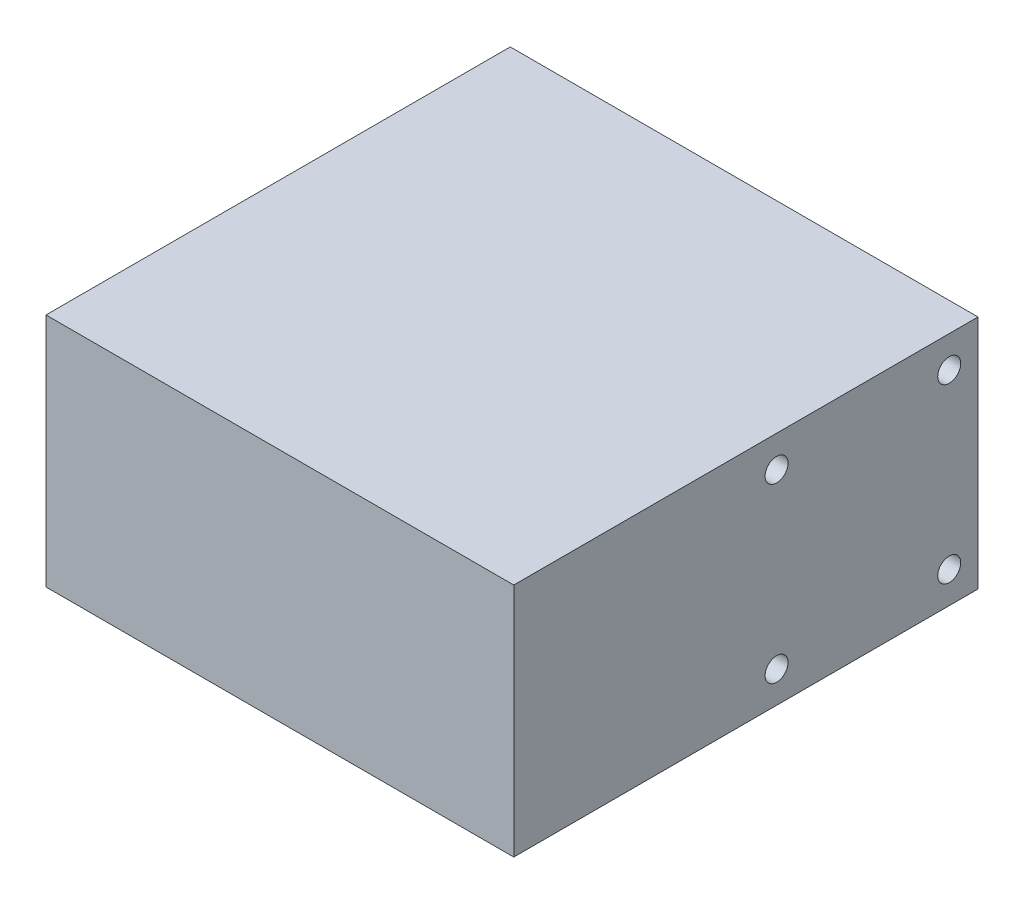
ISO-10303-21;
HEADER;
FILE_DESCRIPTION(('STEP AP214'),'2;1');
FILE_NAME('part.step','',(''),(''),'','','');
FILE_SCHEMA(('AUTOMOTIVE_DESIGN { 1 0 10303 214 1 1 1 1 }'));
ENDSEC;
DATA;
#1=APPLICATION_CONTEXT('core data for automotive mechanical design processes');
#2=APPLICATION_PROTOCOL_DEFINITION('international standard','automotive_design',2000,#1);
#3=PRODUCT_CONTEXT('',#1,'mechanical');
#4=PRODUCT('Part','Part','',(#3));
#5=PRODUCT_RELATED_PRODUCT_CATEGORY('part','',(#4));
#6=PRODUCT_DEFINITION_FORMATION('','',#4);
#7=PRODUCT_DEFINITION_CONTEXT('part definition',#1,'design');
#8=PRODUCT_DEFINITION('design','',#6,#7);
#9=PRODUCT_DEFINITION_SHAPE('','',#8);
#10=(LENGTH_UNIT() NAMED_UNIT(*) SI_UNIT(.MILLI.,.METRE.));
#11=(NAMED_UNIT(*) PLANE_ANGLE_UNIT() SI_UNIT($,.RADIAN.));
#12=(NAMED_UNIT(*) SI_UNIT($,.STERADIAN.) SOLID_ANGLE_UNIT());
#13=UNCERTAINTY_MEASURE_WITH_UNIT(LENGTH_MEASURE(1.E-05),#10,'distance_accuracy_value','');
#14=(GEOMETRIC_REPRESENTATION_CONTEXT(3) GLOBAL_UNCERTAINTY_ASSIGNED_CONTEXT((#13)) GLOBAL_UNIT_ASSIGNED_CONTEXT((#10,
#11,#12)) REPRESENTATION_CONTEXT('',''));
#15=CARTESIAN_POINT('',(0.,0.,0.));
#16=DIRECTION('',(0.,0.,1.));
#17=DIRECTION('',(1.,0.,0.));
#18=AXIS2_PLACEMENT_3D('',#15,#16,#17);
#19=CARTESIAN_POINT('',(0.,20.4724,0.));
#20=DIRECTION('',(1.,0.,0.));
#21=DIRECTION('',(0.,0.,-1.));
#22=AXIS2_PLACEMENT_3D('',#19,#20,#21);
#23=PLANE('',#22);
#24=CARTESIAN_POINT('',(0.,2.736,-37.8352));
#25=DIRECTION('',(-1.,0.,0.));
#26=DIRECTION('',(0.,0.,1.));
#27=AXIS2_PLACEMENT_3D('',#24,#25,#26);
#28=CIRCLE('',#27,0.999999999999998);
#29=CARTESIAN_POINT('',(0.,2.736,-36.8352));
#30=VERTEX_POINT('',#29);
#31=EDGE_CURVE('E197',#30,#30,#28,.T.);
#32=ORIENTED_EDGE('',*,*,#31,.F.);
#33=EDGE_LOOP('',(#32));
#34=FACE_BOUND('',#33,.T.);
#35=CARTESIAN_POINT('',(0.,17.736,-22.8352));
#36=DIRECTION('',(-1.,0.,0.));
#37=DIRECTION('',(0.,0.,1.));
#38=AXIS2_PLACEMENT_3D('',#35,#36,#37);
#39=CIRCLE('',#38,1.);
#40=CARTESIAN_POINT('',(0.,17.736,-21.8352));
#41=VERTEX_POINT('',#40);
#42=EDGE_CURVE('E191',#41,#41,#39,.T.);
#43=ORIENTED_EDGE('',*,*,#42,.F.);
#44=EDGE_LOOP('',(#43));
#45=FACE_BOUND('',#44,.T.);
#46=CARTESIAN_POINT('',(0.,2.736,-22.8352));
#47=DIRECTION('',(-1.,0.,0.));
#48=DIRECTION('',(0.,0.,1.));
#49=AXIS2_PLACEMENT_3D('',#46,#47,#48);
#50=CIRCLE('',#49,1.);
#51=CARTESIAN_POINT('',(0.,2.736,-21.8352));
#52=VERTEX_POINT('',#51);
#53=EDGE_CURVE('E188',#52,#52,#50,.T.);
#54=ORIENTED_EDGE('',*,*,#53,.F.);
#55=EDGE_LOOP('',(#54));
#56=FACE_BOUND('',#55,.T.);
#57=CARTESIAN_POINT('',(0.,17.736,-37.8352));
#58=DIRECTION('',(-1.,0.,0.));
#59=DIRECTION('',(0.,0.,1.));
#60=AXIS2_PLACEMENT_3D('',#57,#58,#59);
#61=CIRCLE('',#60,0.999999999999998);
#62=CARTESIAN_POINT('',(0.,17.736,-36.8352));
#63=VERTEX_POINT('',#62);
#64=EDGE_CURVE('E154',#63,#63,#61,.T.);
#65=ORIENTED_EDGE('',*,*,#64,.F.);
#66=EDGE_LOOP('',(#65));
#67=FACE_BOUND('',#66,.T.);
#68=CARTESIAN_POINT('',(0.,10.2362,-10.541));
#69=DIRECTION('',(1.,0.,0.));
#70=DIRECTION('',(0.,0.,-1.));
#71=AXIS2_PLACEMENT_3D('',#68,#69,#70);
#72=CIRCLE('',#71,2.921);
#73=CARTESIAN_POINT('',(0.,10.2362,-13.462));
#74=VERTEX_POINT('',#73);
#75=EDGE_CURVE('E11',#74,#74,#72,.F.);
#76=ORIENTED_EDGE('',*,*,#75,.F.);
#77=EDGE_LOOP('',(#76));
#78=FACE_BOUND('',#77,.T.);
#79=DIRECTION('',(0.,0.,1.));
#80=VECTOR('',#79,1.);
#81=CARTESIAN_POINT('',(0.,0.,0.));
#82=LINE('',#81,#80);
#83=CARTESIAN_POINT('',(0.,0.,-40.3352));
#84=VERTEX_POINT('',#83);
#85=CARTESIAN_POINT('',(0.,0.,0.));
#86=VERTEX_POINT('',#85);
#87=EDGE_CURVE('E98',#84,#86,#82,.T.);
#88=ORIENTED_EDGE('',*,*,#87,.T.);
#89=DIRECTION('',(0.,-1.,0.));
#90=VECTOR('',#89,1.);
#91=CARTESIAN_POINT('',(0.,20.4724,0.));
#92=LINE('',#91,#90);
#93=CARTESIAN_POINT('',(0.,20.4724,0.));
#94=VERTEX_POINT('',#93);
#95=EDGE_CURVE('E40',#94,#86,#92,.T.);
#96=ORIENTED_EDGE('',*,*,#95,.F.);
#97=DIRECTION('',(0.,0.,1.));
#98=VECTOR('',#97,1.);
#99=CARTESIAN_POINT('',(0.,20.4724,0.));
#100=LINE('',#99,#98);
#101=CARTESIAN_POINT('',(0.,20.4724,-40.3352));
#102=VERTEX_POINT('',#101);
#103=EDGE_CURVE('E84',#102,#94,#100,.T.);
#104=ORIENTED_EDGE('',*,*,#103,.F.);
#105=DIRECTION('',(0.,-1.,0.));
#106=VECTOR('',#105,1.);
#107=CARTESIAN_POINT('',(0.,20.4724,-40.3352));
#108=LINE('',#107,#106);
#109=EDGE_CURVE('E94',#102,#84,#108,.T.);
#110=ORIENTED_EDGE('',*,*,#109,.T.);
#111=EDGE_LOOP('',(#88,#96,#104,#110));
#112=FACE_BOUND('',#111,.T.);
#113=ADVANCED_FACE('F32',(#34,#45,#56,#67,#78,#112),#23,.F.);
#114=CARTESIAN_POINT('',(0.,20.4724,0.));
#115=DIRECTION('',(0.,0.,-1.));
#116=DIRECTION('',(-1.,0.,0.));
#117=AXIS2_PLACEMENT_3D('',#114,#115,#116);
#118=PLANE('',#117);
#119=DIRECTION('',(1.,0.,0.));
#120=VECTOR('',#119,1.);
#121=CARTESIAN_POINT('',(0.,0.,0.));
#122=LINE('',#121,#120);
#123=CARTESIAN_POINT('',(40.64,0.,0.));
#124=VERTEX_POINT('',#123);
#125=EDGE_CURVE('E89',#86,#124,#122,.T.);
#126=ORIENTED_EDGE('',*,*,#125,.T.);
#127=DIRECTION('',(0.,-1.,0.));
#128=VECTOR('',#127,1.);
#129=CARTESIAN_POINT('',(40.64,20.4724,0.));
#130=LINE('',#129,#128);
#131=CARTESIAN_POINT('',(40.64,20.4724,0.));
#132=VERTEX_POINT('',#131);
#133=EDGE_CURVE('E87',#132,#124,#130,.T.);
#134=ORIENTED_EDGE('',*,*,#133,.F.);
#135=DIRECTION('',(1.,0.,0.));
#136=VECTOR('',#135,1.);
#137=CARTESIAN_POINT('',(0.,20.4724,0.));
#138=LINE('',#137,#136);
#139=EDGE_CURVE('E79',#94,#132,#138,.T.);
#140=ORIENTED_EDGE('',*,*,#139,.F.);
#141=ORIENTED_EDGE('',*,*,#95,.T.);
#142=EDGE_LOOP('',(#126,#134,#140,#141));
#143=FACE_BOUND('',#142,.T.);
#144=ADVANCED_FACE('F88',(#143),#118,.F.);
#145=CARTESIAN_POINT('',(40.64,20.4724,0.));
#146=DIRECTION('',(-1.,0.,0.));
#147=DIRECTION('',(0.,0.,1.));
#148=AXIS2_PLACEMENT_3D('',#145,#146,#147);
#149=PLANE('',#148);
#150=CARTESIAN_POINT('',(40.64,2.736,-37.8352));
#151=DIRECTION('',(-1.,0.,0.));
#152=DIRECTION('',(0.,0.,1.));
#153=AXIS2_PLACEMENT_3D('',#150,#151,#152);
#154=CIRCLE('',#153,0.999999999999998);
#155=CARTESIAN_POINT('',(40.64,2.736,-36.8352));
#156=VERTEX_POINT('',#155);
#157=EDGE_CURVE('E194',#156,#156,#154,.T.);
#158=ORIENTED_EDGE('',*,*,#157,.T.);
#159=EDGE_LOOP('',(#158));
#160=FACE_BOUND('',#159,.T.);
#161=CARTESIAN_POINT('',(40.64,17.736,-22.8352));
#162=DIRECTION('',(-1.,0.,0.));
#163=DIRECTION('',(0.,0.,1.));
#164=AXIS2_PLACEMENT_3D('',#161,#162,#163);
#165=CIRCLE('',#164,1.);
#166=CARTESIAN_POINT('',(40.64,17.736,-21.8352));
#167=VERTEX_POINT('',#166);
#168=EDGE_CURVE('E200',#167,#167,#165,.T.);
#169=ORIENTED_EDGE('',*,*,#168,.T.);
#170=EDGE_LOOP('',(#169));
#171=FACE_BOUND('',#170,.T.);
#172=CARTESIAN_POINT('',(40.64,2.736,-22.8352));
#173=DIRECTION('',(-1.,0.,0.));
#174=DIRECTION('',(0.,0.,1.));
#175=AXIS2_PLACEMENT_3D('',#172,#173,#174);
#176=CIRCLE('',#175,1.);
#177=CARTESIAN_POINT('',(40.64,2.736,-21.8352));
#178=VERTEX_POINT('',#177);
#179=EDGE_CURVE('E185',#178,#178,#176,.T.);
#180=ORIENTED_EDGE('',*,*,#179,.T.);
#181=EDGE_LOOP('',(#180));
#182=FACE_BOUND('',#181,.T.);
#183=CARTESIAN_POINT('',(40.64,17.736,-37.8352));
#184=DIRECTION('',(-1.,0.,0.));
#185=DIRECTION('',(0.,0.,1.));
#186=AXIS2_PLACEMENT_3D('',#183,#184,#185);
#187=CIRCLE('',#186,0.999999999999998);
#188=CARTESIAN_POINT('',(40.64,17.736,-36.8352));
#189=VERTEX_POINT('',#188);
#190=EDGE_CURVE('E149',#189,#189,#187,.T.);
#191=ORIENTED_EDGE('',*,*,#190,.T.);
#192=EDGE_LOOP('',(#191));
#193=FACE_BOUND('',#192,.T.);
#194=DIRECTION('',(0.,0.,-1.));
#195=VECTOR('',#194,1.);
#196=CARTESIAN_POINT('',(40.64,0.,0.));
#197=LINE('',#196,#195);
#198=CARTESIAN_POINT('',(40.64,0.,-40.3352));
#199=VERTEX_POINT('',#198);
#200=EDGE_CURVE('E65',#124,#199,#197,.T.);
#201=ORIENTED_EDGE('',*,*,#200,.T.);
#202=DIRECTION('',(0.,-1.,0.));
#203=VECTOR('',#202,1.);
#204=CARTESIAN_POINT('',(40.64,20.4724,-40.3352));
#205=LINE('',#204,#203);
#206=CARTESIAN_POINT('',(40.64,20.4724,-40.3352));
#207=VERTEX_POINT('',#206);
#208=EDGE_CURVE('E90',#207,#199,#205,.T.);
#209=ORIENTED_EDGE('',*,*,#208,.F.);
#210=DIRECTION('',(0.,0.,-1.));
#211=VECTOR('',#210,1.);
#212=CARTESIAN_POINT('',(40.64,20.4724,0.));
#213=LINE('',#212,#211);
#214=EDGE_CURVE('E82',#132,#207,#213,.T.);
#215=ORIENTED_EDGE('',*,*,#214,.F.);
#216=ORIENTED_EDGE('',*,*,#133,.T.);
#217=EDGE_LOOP('',(#201,#209,#215,#216));
#218=FACE_BOUND('',#217,.T.);
#219=ADVANCED_FACE('F92',(#160,#171,#182,#193,#218),#149,.F.);
#220=CARTESIAN_POINT('',(0.,20.4724,-40.3352));
#221=DIRECTION('',(0.,0.,1.));
#222=DIRECTION('',(1.,0.,0.));
#223=AXIS2_PLACEMENT_3D('',#220,#221,#222);
#224=PLANE('',#223);
#225=DIRECTION('',(-1.,0.,0.));
#226=VECTOR('',#225,1.);
#227=CARTESIAN_POINT('',(0.,0.,-40.3352));
#228=LINE('',#227,#226);
#229=EDGE_CURVE('E71',#199,#84,#228,.T.);
#230=ORIENTED_EDGE('',*,*,#229,.T.);
#231=ORIENTED_EDGE('',*,*,#109,.F.);
#232=DIRECTION('',(-1.,0.,0.));
#233=VECTOR('',#232,1.);
#234=CARTESIAN_POINT('',(0.,20.4724,-40.3352));
#235=LINE('',#234,#233);
#236=EDGE_CURVE('E48',#207,#102,#235,.T.);
#237=ORIENTED_EDGE('',*,*,#236,.F.);
#238=ORIENTED_EDGE('',*,*,#208,.T.);
#239=EDGE_LOOP('',(#230,#231,#237,#238));
#240=FACE_BOUND('',#239,.T.);
#241=ADVANCED_FACE('F120',(#240),#224,.F.);
#242=CARTESIAN_POINT('',(0.,20.4724,0.));
#243=DIRECTION('',(0.,-1.,0.));
#244=DIRECTION('',(0.,0.,-1.));
#245=AXIS2_PLACEMENT_3D('',#242,#243,#244);
#246=PLANE('',#245);
#247=ORIENTED_EDGE('',*,*,#103,.T.);
#248=ORIENTED_EDGE('',*,*,#139,.T.);
#249=ORIENTED_EDGE('',*,*,#214,.T.);
#250=ORIENTED_EDGE('',*,*,#236,.T.);
#251=EDGE_LOOP('',(#247,#248,#249,#250));
#252=FACE_BOUND('',#251,.T.);
#253=ADVANCED_FACE('F80',(#252),#246,.F.);
#254=CARTESIAN_POINT('',(0.,0.,0.));
#255=DIRECTION('',(0.,-1.,0.));
#256=DIRECTION('',(0.,0.,-1.));
#257=AXIS2_PLACEMENT_3D('',#254,#255,#256);
#258=PLANE('',#257);
#259=ORIENTED_EDGE('',*,*,#87,.F.);
#260=ORIENTED_EDGE('',*,*,#229,.F.);
#261=ORIENTED_EDGE('',*,*,#200,.F.);
#262=ORIENTED_EDGE('',*,*,#125,.F.);
#263=EDGE_LOOP('',(#259,#260,#261,#262));
#264=FACE_BOUND('',#263,.T.);
#265=ADVANCED_FACE('F109',(#264),#258,.T.);
#266=CARTESIAN_POINT('',(-5.08,10.2362,-10.541));
#267=DIRECTION('',(-1.,0.,0.));
#268=DIRECTION('',(0.,0.,1.));
#269=AXIS2_PLACEMENT_3D('',#266,#267,#268);
#270=PLANE('',#269);
#271=CARTESIAN_POINT('',(-5.08,10.2362,-10.541));
#272=DIRECTION('',(-1.,0.,0.));
#273=DIRECTION('',(0.,0.,1.));
#274=AXIS2_PLACEMENT_3D('',#271,#272,#273);
#275=CIRCLE('',#274,2.921);
#276=CARTESIAN_POINT('',(-5.08,10.2362,-7.62));
#277=VERTEX_POINT('',#276);
#278=EDGE_CURVE('E101',#277,#277,#275,.T.);
#279=ORIENTED_EDGE('',*,*,#278,.T.);
#280=EDGE_LOOP('',(#279));
#281=FACE_BOUND('',#280,.T.);
#282=CARTESIAN_POINT('',(-5.08,10.2362,-10.541));
#283=DIRECTION('',(-1.,0.,0.));
#284=DIRECTION('',(0.,0.,1.));
#285=AXIS2_PLACEMENT_3D('',#282,#283,#284);
#286=CIRCLE('',#285,0.698499999999999);
#287=CARTESIAN_POINT('',(-5.08,10.2362,-9.8425));
#288=VERTEX_POINT('',#287);
#289=EDGE_CURVE('E148',#288,#288,#286,.T.);
#290=ORIENTED_EDGE('',*,*,#289,.F.);
#291=EDGE_LOOP('',(#290));
#292=FACE_BOUND('',#291,.T.);
#293=ADVANCED_FACE('F111',(#281,#292),#270,.T.);
#294=CARTESIAN_POINT('',(-5.08,10.2362,-10.541));
#295=DIRECTION('',(1.,0.,0.));
#296=DIRECTION('',(0.,0.,-1.));
#297=AXIS2_PLACEMENT_3D('',#294,#295,#296);
#298=CYLINDRICAL_SURFACE('',#297,2.921);
#299=ORIENTED_EDGE('',*,*,#278,.F.);
#300=EDGE_LOOP('',(#299));
#301=FACE_BOUND('',#300,.T.);
#302=ORIENTED_EDGE('',*,*,#75,.T.);
#303=EDGE_LOOP('',(#302));
#304=FACE_BOUND('',#303,.T.);
#305=ADVANCED_FACE('F117',(#301,#304),#298,.T.);
#306=CARTESIAN_POINT('',(-5.08,10.2362,-10.541));
#307=DIRECTION('',(1.,0.,0.));
#308=DIRECTION('',(0.,0.,-1.));
#309=AXIS2_PLACEMENT_3D('',#306,#307,#308);
#310=CYLINDRICAL_SURFACE('',#309,0.698499999999999);
#311=ORIENTED_EDGE('',*,*,#289,.T.);
#312=EDGE_LOOP('',(#311));
#313=FACE_BOUND('',#312,.T.);
#314=CARTESIAN_POINT('',(0.,10.2362,-10.541));
#315=DIRECTION('',(-1.,0.,0.));
#316=DIRECTION('',(0.,0.,1.));
#317=AXIS2_PLACEMENT_3D('',#314,#315,#316);
#318=CIRCLE('',#317,0.698499999999999);
#319=CARTESIAN_POINT('',(0.,10.2362,-9.8425));
#320=VERTEX_POINT('',#319);
#321=EDGE_CURVE('E146',#320,#320,#318,.T.);
#322=ORIENTED_EDGE('',*,*,#321,.F.);
#323=EDGE_LOOP('',(#322));
#324=FACE_BOUND('',#323,.T.);
#325=ADVANCED_FACE('F133',(#313,#324),#310,.F.);
#326=ORIENTED_EDGE('',*,*,#321,.T.);
#327=EDGE_LOOP('',(#326));
#328=FACE_BOUND('',#327,.T.);
#329=ADVANCED_FACE('F125',(#328),#23,.F.);
#330=CARTESIAN_POINT('',(40.64,17.736,-37.8352));
#331=DIRECTION('',(-1.,0.,0.));
#332=DIRECTION('',(0.,0.,1.));
#333=AXIS2_PLACEMENT_3D('',#330,#331,#332);
#334=CYLINDRICAL_SURFACE('',#333,0.999999999999998);
#335=ORIENTED_EDGE('',*,*,#190,.F.);
#336=EDGE_LOOP('',(#335));
#337=FACE_BOUND('',#336,.T.);
#338=ORIENTED_EDGE('',*,*,#64,.T.);
#339=EDGE_LOOP('',(#338));
#340=FACE_BOUND('',#339,.T.);
#341=ADVANCED_FACE('F132',(#337,#340),#334,.F.);
#342=CARTESIAN_POINT('',(40.64,2.736,-22.8352));
#343=DIRECTION('',(-1.,0.,0.));
#344=DIRECTION('',(0.,0.,1.));
#345=AXIS2_PLACEMENT_3D('',#342,#343,#344);
#346=CYLINDRICAL_SURFACE('',#345,1.);
#347=ORIENTED_EDGE('',*,*,#179,.F.);
#348=EDGE_LOOP('',(#347));
#349=FACE_BOUND('',#348,.T.);
#350=ORIENTED_EDGE('',*,*,#53,.T.);
#351=EDGE_LOOP('',(#350));
#352=FACE_BOUND('',#351,.T.);
#353=ADVANCED_FACE('F139',(#349,#352),#346,.F.);
#354=CARTESIAN_POINT('',(40.64,17.736,-22.8352));
#355=DIRECTION('',(-1.,0.,0.));
#356=DIRECTION('',(0.,0.,1.));
#357=AXIS2_PLACEMENT_3D('',#354,#355,#356);
#358=CYLINDRICAL_SURFACE('',#357,1.);
#359=ORIENTED_EDGE('',*,*,#168,.F.);
#360=EDGE_LOOP('',(#359));
#361=FACE_BOUND('',#360,.T.);
#362=ORIENTED_EDGE('',*,*,#42,.T.);
#363=EDGE_LOOP('',(#362));
#364=FACE_BOUND('',#363,.T.);
#365=ADVANCED_FACE('F170',(#361,#364),#358,.F.);
#366=CARTESIAN_POINT('',(40.64,2.736,-37.8352));
#367=DIRECTION('',(-1.,0.,0.));
#368=DIRECTION('',(0.,0.,1.));
#369=AXIS2_PLACEMENT_3D('',#366,#367,#368);
#370=CYLINDRICAL_SURFACE('',#369,0.999999999999998);
#371=ORIENTED_EDGE('',*,*,#157,.F.);
#372=EDGE_LOOP('',(#371));
#373=FACE_BOUND('',#372,.T.);
#374=ORIENTED_EDGE('',*,*,#31,.T.);
#375=EDGE_LOOP('',(#374));
#376=FACE_BOUND('',#375,.T.);
#377=ADVANCED_FACE('F173',(#373,#376),#370,.F.);
#378=CLOSED_SHELL('',(#113,#144,#219,#241,#253,#265,#293,#305,#325,#329,#341,#353,#365,#377));
#379=MANIFOLD_SOLID_BREP('B2',#378);
#380=ADVANCED_BREP_SHAPE_REPRESENTATION('',(#18,#379),#14);
#381=SHAPE_DEFINITION_REPRESENTATION(#9,#380);
ENDSEC;
END-ISO-10303-21;
